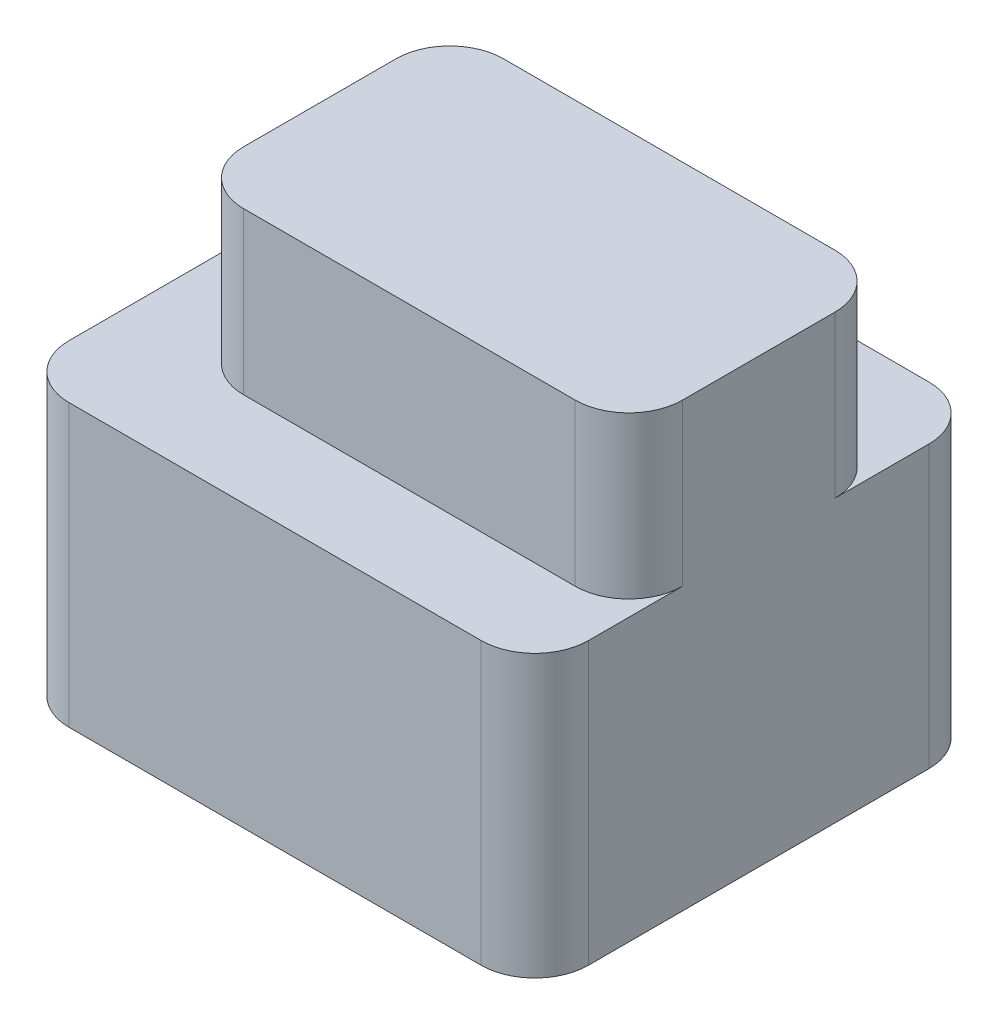
ISO-10303-21;
HEADER;
FILE_DESCRIPTION(('STEP AP214'),'2;1');
FILE_NAME('part.step','',(''),(''),'','','');
FILE_SCHEMA(('AUTOMOTIVE_DESIGN { 1 0 10303 214 1 1 1 1 }'));
ENDSEC;
DATA;
#1=APPLICATION_CONTEXT('core data for automotive mechanical design processes');
#2=APPLICATION_PROTOCOL_DEFINITION('international standard','automotive_design',2000,#1);
#3=PRODUCT_CONTEXT('',#1,'mechanical');
#4=PRODUCT('Part','Part','',(#3));
#5=PRODUCT_RELATED_PRODUCT_CATEGORY('part','',(#4));
#6=PRODUCT_DEFINITION_FORMATION('','',#4);
#7=PRODUCT_DEFINITION_CONTEXT('part definition',#1,'design');
#8=PRODUCT_DEFINITION('design','',#6,#7);
#9=PRODUCT_DEFINITION_SHAPE('','',#8);
#10=(LENGTH_UNIT() NAMED_UNIT(*) SI_UNIT(.MILLI.,.METRE.));
#11=(NAMED_UNIT(*) PLANE_ANGLE_UNIT() SI_UNIT($,.RADIAN.));
#12=(NAMED_UNIT(*) SI_UNIT($,.STERADIAN.) SOLID_ANGLE_UNIT());
#13=UNCERTAINTY_MEASURE_WITH_UNIT(LENGTH_MEASURE(1.E-05),#10,'distance_accuracy_value','');
#14=(GEOMETRIC_REPRESENTATION_CONTEXT(3) GLOBAL_UNCERTAINTY_ASSIGNED_CONTEXT((#13)) GLOBAL_UNIT_ASSIGNED_CONTEXT((#10,
#11,#12)) REPRESENTATION_CONTEXT('',''));
#15=CARTESIAN_POINT('',(0.,0.,0.));
#16=DIRECTION('',(0.,0.,1.));
#17=DIRECTION('',(1.,0.,0.));
#18=AXIS2_PLACEMENT_3D('',#15,#16,#17);
#19=CARTESIAN_POINT('',(0.,0.8,0.));
#20=DIRECTION('',(0.,-1.,0.));
#21=DIRECTION('',(0.,0.,-1.));
#22=AXIS2_PLACEMENT_3D('',#19,#20,#21);
#23=PLANE('',#22);
#24=DIRECTION('',(0.,0.,1.));
#25=VECTOR('',#24,1.);
#26=CARTESIAN_POINT('',(5.8,0.8,110.));
#27=LINE('',#26,#25);
#28=CARTESIAN_POINT('',(5.8,0.8,110.6));
#29=VERTEX_POINT('',#28);
#30=CARTESIAN_POINT('',(5.8,0.8,111.65));
#31=VERTEX_POINT('',#30);
#32=EDGE_CURVE('E222',#29,#31,#27,.T.);
#33=ORIENTED_EDGE('',*,*,#32,.F.);
#34=CARTESIAN_POINT('',(5.2,0.8,110.6));
#35=DIRECTION('',(0.,-1.,0.));
#36=DIRECTION('',(0.,0.,-1.));
#37=AXIS2_PLACEMENT_3D('',#34,#35,#36);
#38=CIRCLE('',#37,0.6);
#39=CARTESIAN_POINT('',(5.2,0.8,110.));
#40=VERTEX_POINT('',#39);
#41=EDGE_CURVE('E238',#29,#40,#38,.F.);
#42=ORIENTED_EDGE('',*,*,#41,.T.);
#43=DIRECTION('',(1.,0.,0.));
#44=VECTOR('',#43,1.);
#45=CARTESIAN_POINT('',(0.,0.8,110.));
#46=LINE('',#45,#44);
#47=CARTESIAN_POINT('',(0.6,0.8,110.));
#48=VERTEX_POINT('',#47);
#49=EDGE_CURVE('E217',#48,#40,#46,.T.);
#50=ORIENTED_EDGE('',*,*,#49,.F.);
#51=CARTESIAN_POINT('',(0.6,0.8,110.6));
#52=DIRECTION('',(0.,-1.,0.));
#53=DIRECTION('',(0.,0.,-1.));
#54=AXIS2_PLACEMENT_3D('',#51,#52,#53);
#55=CIRCLE('',#54,0.6);
#56=CARTESIAN_POINT('',(0.,0.8,110.6));
#57=VERTEX_POINT('',#56);
#58=EDGE_CURVE('E161',#48,#57,#55,.F.);
#59=ORIENTED_EDGE('',*,*,#58,.T.);
#60=DIRECTION('',(0.,0.,-1.));
#61=VECTOR('',#60,1.);
#62=CARTESIAN_POINT('',(0.,0.8,115.));
#63=LINE('',#62,#61);
#64=CARTESIAN_POINT('',(0.,0.8,114.4));
#65=VERTEX_POINT('',#64);
#66=EDGE_CURVE('E207',#65,#57,#63,.T.);
#67=ORIENTED_EDGE('',*,*,#66,.F.);
#68=CARTESIAN_POINT('',(0.6,0.8,114.4));
#69=DIRECTION('',(0.,-1.,0.));
#70=DIRECTION('',(0.,0.,-1.));
#71=AXIS2_PLACEMENT_3D('',#68,#69,#70);
#72=CIRCLE('',#71,0.6);
#73=CARTESIAN_POINT('',(0.6,0.8,115.));
#74=VERTEX_POINT('',#73);
#75=EDGE_CURVE('E236',#65,#74,#72,.F.);
#76=ORIENTED_EDGE('',*,*,#75,.T.);
#77=DIRECTION('',(-1.,0.,0.));
#78=VECTOR('',#77,1.);
#79=CARTESIAN_POINT('',(5.8,0.8,115.));
#80=LINE('',#79,#78);
#81=CARTESIAN_POINT('',(5.2,0.8,115.));
#82=VERTEX_POINT('',#81);
#83=EDGE_CURVE('E167',#82,#74,#80,.T.);
#84=ORIENTED_EDGE('',*,*,#83,.F.);
#85=CARTESIAN_POINT('',(5.2,0.8,114.4));
#86=DIRECTION('',(0.,-1.,0.));
#87=DIRECTION('',(0.,0.,-1.));
#88=AXIS2_PLACEMENT_3D('',#85,#86,#87);
#89=CIRCLE('',#88,0.6);
#90=CARTESIAN_POINT('',(5.8,0.8,114.4));
#91=VERTEX_POINT('',#90);
#92=EDGE_CURVE('E237',#82,#91,#89,.F.);
#93=ORIENTED_EDGE('',*,*,#92,.T.);
#94=CARTESIAN_POINT('',(5.8,0.8,113.35));
#95=VERTEX_POINT('',#94);
#96=EDGE_CURVE('E219',#95,#91,#27,.T.);
#97=ORIENTED_EDGE('',*,*,#96,.F.);
#98=CARTESIAN_POINT('',(5.2,0.8,113.35));
#99=DIRECTION('',(0.,-1.,0.));
#100=DIRECTION('',(0.,0.,-1.));
#101=AXIS2_PLACEMENT_3D('',#98,#99,#100);
#102=CIRCLE('',#101,0.6);
#103=CARTESIAN_POINT('',(5.2,0.8,113.95));
#104=VERTEX_POINT('',#103);
#105=EDGE_CURVE('E11',#95,#104,#102,.T.);
#106=ORIENTED_EDGE('',*,*,#105,.T.);
#107=DIRECTION('',(1.,0.,0.));
#108=VECTOR('',#107,1.);
#109=CARTESIAN_POINT('',(5.8,0.8,113.95));
#110=LINE('',#109,#108);
#111=CARTESIAN_POINT('',(1.5,0.8,113.95));
#112=VERTEX_POINT('',#111);
#113=EDGE_CURVE('E205',#112,#104,#110,.T.);
#114=ORIENTED_EDGE('',*,*,#113,.F.);
#115=CARTESIAN_POINT('',(1.5,0.8,113.35));
#116=DIRECTION('',(0.,-1.,0.));
#117=DIRECTION('',(0.,0.,-1.));
#118=AXIS2_PLACEMENT_3D('',#115,#116,#117);
#119=CIRCLE('',#118,0.6);
#120=CARTESIAN_POINT('',(0.9,0.8,113.35));
#121=VERTEX_POINT('',#120);
#122=EDGE_CURVE('E272',#112,#121,#119,.T.);
#123=ORIENTED_EDGE('',*,*,#122,.T.);
#124=DIRECTION('',(0.,0.,1.));
#125=VECTOR('',#124,1.);
#126=CARTESIAN_POINT('',(0.9,0.8,113.95));
#127=LINE('',#126,#125);
#128=CARTESIAN_POINT('',(0.9,0.8,111.65));
#129=VERTEX_POINT('',#128);
#130=EDGE_CURVE('E215',#129,#121,#127,.T.);
#131=ORIENTED_EDGE('',*,*,#130,.F.);
#132=CARTESIAN_POINT('',(1.5,0.8,111.65));
#133=DIRECTION('',(0.,-1.,0.));
#134=DIRECTION('',(0.,0.,-1.));
#135=AXIS2_PLACEMENT_3D('',#132,#133,#134);
#136=CIRCLE('',#135,0.6);
#137=CARTESIAN_POINT('',(1.5,0.8,111.05));
#138=VERTEX_POINT('',#137);
#139=EDGE_CURVE('E271',#129,#138,#136,.T.);
#140=ORIENTED_EDGE('',*,*,#139,.T.);
#141=DIRECTION('',(-1.,0.,0.));
#142=VECTOR('',#141,1.);
#143=CARTESIAN_POINT('',(0.9,0.8,111.05));
#144=LINE('',#143,#142);
#145=CARTESIAN_POINT('',(5.2,0.8,111.05));
#146=VERTEX_POINT('',#145);
#147=EDGE_CURVE('E197',#146,#138,#144,.T.);
#148=ORIENTED_EDGE('',*,*,#147,.F.);
#149=CARTESIAN_POINT('',(5.2,0.8,111.65));
#150=DIRECTION('',(0.,-1.,0.));
#151=DIRECTION('',(0.,0.,-1.));
#152=AXIS2_PLACEMENT_3D('',#149,#150,#151);
#153=CIRCLE('',#152,0.6);
#154=EDGE_CURVE('E47',#146,#31,#153,.T.);
#155=ORIENTED_EDGE('',*,*,#154,.T.);
#156=EDGE_LOOP('',(#33,#42,#50,#59,#67,#76,#84,#93,#97,#106,#114,#123,#131,#140,#148,#155));
#157=FACE_BOUND('',#156,.T.);
#158=ADVANCED_FACE('F41',(#157),#23,.F.);
#159=CARTESIAN_POINT('',(0.,0.8,115.));
#160=DIRECTION('',(-1.,0.,0.));
#161=DIRECTION('',(0.,0.,1.));
#162=AXIS2_PLACEMENT_3D('',#159,#160,#161);
#163=PLANE('',#162);
#164=DIRECTION('',(0.,-1.,0.));
#165=VECTOR('',#164,1.);
#166=CARTESIAN_POINT('',(0.,0.8,110.6));
#167=LINE('',#166,#165);
#168=CARTESIAN_POINT('',(0.,-2.34,110.6));
#169=VERTEX_POINT('',#168);
#170=EDGE_CURVE('E249',#57,#169,#167,.T.);
#171=ORIENTED_EDGE('',*,*,#170,.T.);
#172=DIRECTION('',(0.,0.,-1.));
#173=VECTOR('',#172,1.);
#174=CARTESIAN_POINT('',(0.,-2.34,114.4));
#175=LINE('',#174,#173);
#176=CARTESIAN_POINT('',(0.,-2.34,114.4));
#177=VERTEX_POINT('',#176);
#178=EDGE_CURVE('E182',#177,#169,#175,.T.);
#179=ORIENTED_EDGE('',*,*,#178,.F.);
#180=DIRECTION('',(0.,-1.,0.));
#181=VECTOR('',#180,1.);
#182=CARTESIAN_POINT('',(0.,0.8,114.4));
#183=LINE('',#182,#181);
#184=EDGE_CURVE('E250',#177,#65,#183,.F.);
#185=ORIENTED_EDGE('',*,*,#184,.T.);
#186=ORIENTED_EDGE('',*,*,#66,.T.);
#187=EDGE_LOOP('',(#171,#179,#185,#186));
#188=FACE_BOUND('',#187,.T.);
#189=ADVANCED_FACE('F309',(#188),#163,.T.);
#190=CARTESIAN_POINT('',(5.8,0.8,115.));
#191=DIRECTION('',(0.,0.,1.));
#192=DIRECTION('',(1.,0.,0.));
#193=AXIS2_PLACEMENT_3D('',#190,#191,#192);
#194=PLANE('',#193);
#195=ORIENTED_EDGE('',*,*,#83,.T.);
#196=DIRECTION('',(0.,-1.,0.));
#197=VECTOR('',#196,1.);
#198=CARTESIAN_POINT('',(0.6,0.8,115.));
#199=LINE('',#198,#197);
#200=CARTESIAN_POINT('',(0.6,-2.34,115.));
#201=VERTEX_POINT('',#200);
#202=EDGE_CURVE('E243',#74,#201,#199,.T.);
#203=ORIENTED_EDGE('',*,*,#202,.T.);
#204=DIRECTION('',(-1.,0.,0.));
#205=VECTOR('',#204,1.);
#206=CARTESIAN_POINT('',(5.2,-2.34,115.));
#207=LINE('',#206,#205);
#208=CARTESIAN_POINT('',(5.2,-2.34,115.));
#209=VERTEX_POINT('',#208);
#210=EDGE_CURVE('E194',#209,#201,#207,.T.);
#211=ORIENTED_EDGE('',*,*,#210,.F.);
#212=DIRECTION('',(0.,-1.,0.));
#213=VECTOR('',#212,1.);
#214=CARTESIAN_POINT('',(5.2,0.8,115.));
#215=LINE('',#214,#213);
#216=EDGE_CURVE('E245',#209,#82,#215,.F.);
#217=ORIENTED_EDGE('',*,*,#216,.T.);
#218=EDGE_LOOP('',(#195,#203,#211,#217));
#219=FACE_BOUND('',#218,.T.);
#220=ADVANCED_FACE('F305',(#219),#194,.T.);
#221=CARTESIAN_POINT('',(5.8,0.8,110.));
#222=DIRECTION('',(1.,0.,0.));
#223=DIRECTION('',(0.,0.,-1.));
#224=AXIS2_PLACEMENT_3D('',#221,#222,#223);
#225=PLANE('',#224);
#226=DIRECTION('',(0.,-1.,0.));
#227=VECTOR('',#226,1.);
#228=CARTESIAN_POINT('',(5.8,0.8,114.4));
#229=LINE('',#228,#227);
#230=CARTESIAN_POINT('',(5.8,-2.34,114.4));
#231=VERTEX_POINT('',#230);
#232=EDGE_CURVE('E234',#91,#231,#229,.T.);
#233=ORIENTED_EDGE('',*,*,#232,.T.);
#234=DIRECTION('',(0.,0.,1.));
#235=VECTOR('',#234,1.);
#236=CARTESIAN_POINT('',(5.8,-2.34,110.6));
#237=LINE('',#236,#235);
#238=CARTESIAN_POINT('',(5.8,-2.34,110.6));
#239=VERTEX_POINT('',#238);
#240=EDGE_CURVE('E183',#239,#231,#237,.T.);
#241=ORIENTED_EDGE('',*,*,#240,.F.);
#242=DIRECTION('',(0.,-1.,0.));
#243=VECTOR('',#242,1.);
#244=CARTESIAN_POINT('',(5.8,0.8,110.6));
#245=LINE('',#244,#243);
#246=EDGE_CURVE('E235',#239,#29,#245,.F.);
#247=ORIENTED_EDGE('',*,*,#246,.T.);
#248=ORIENTED_EDGE('',*,*,#32,.T.);
#249=DIRECTION('',(0.,-1.,0.));
#250=VECTOR('',#249,1.);
#251=CARTESIAN_POINT('',(5.8,2.6,111.65));
#252=LINE('',#251,#250);
#253=CARTESIAN_POINT('',(5.8,2.6,111.65));
#254=VERTEX_POINT('',#253);
#255=EDGE_CURVE('E228',#31,#254,#252,.F.);
#256=ORIENTED_EDGE('',*,*,#255,.T.);
#257=DIRECTION('',(0.,0.,-1.));
#258=VECTOR('',#257,1.);
#259=CARTESIAN_POINT('',(5.8,2.6,111.05));
#260=LINE('',#259,#258);
#261=CARTESIAN_POINT('',(5.8,2.6,113.35));
#262=VERTEX_POINT('',#261);
#263=EDGE_CURVE('E196',#262,#254,#260,.T.);
#264=ORIENTED_EDGE('',*,*,#263,.F.);
#265=DIRECTION('',(0.,-1.,0.));
#266=VECTOR('',#265,1.);
#267=CARTESIAN_POINT('',(5.8,0.8,113.35));
#268=LINE('',#267,#266);
#269=EDGE_CURVE('E226',#262,#95,#268,.T.);
#270=ORIENTED_EDGE('',*,*,#269,.T.);
#271=ORIENTED_EDGE('',*,*,#96,.T.);
#272=EDGE_LOOP('',(#233,#241,#247,#248,#256,#264,#270,#271));
#273=FACE_BOUND('',#272,.T.);
#274=ADVANCED_FACE('F289',(#273),#225,.T.);
#275=CARTESIAN_POINT('',(0.,0.8,110.));
#276=DIRECTION('',(0.,0.,-1.));
#277=DIRECTION('',(-1.,0.,0.));
#278=AXIS2_PLACEMENT_3D('',#275,#276,#277);
#279=PLANE('',#278);
#280=ORIENTED_EDGE('',*,*,#49,.T.);
#281=DIRECTION('',(0.,-1.,0.));
#282=VECTOR('',#281,1.);
#283=CARTESIAN_POINT('',(5.2,0.8,110.));
#284=LINE('',#283,#282);
#285=CARTESIAN_POINT('',(5.2,-2.34,110.));
#286=VERTEX_POINT('',#285);
#287=EDGE_CURVE('E164',#40,#286,#284,.T.);
#288=ORIENTED_EDGE('',*,*,#287,.T.);
#289=DIRECTION('',(1.,0.,0.));
#290=VECTOR('',#289,1.);
#291=CARTESIAN_POINT('',(0.6,-2.34,110.));
#292=LINE('',#291,#290);
#293=CARTESIAN_POINT('',(0.6,-2.34,110.));
#294=VERTEX_POINT('',#293);
#295=EDGE_CURVE('E166',#294,#286,#292,.T.);
#296=ORIENTED_EDGE('',*,*,#295,.F.);
#297=DIRECTION('',(0.,-1.,0.));
#298=VECTOR('',#297,1.);
#299=CARTESIAN_POINT('',(0.6,0.8,110.));
#300=LINE('',#299,#298);
#301=EDGE_CURVE('E154',#294,#48,#300,.F.);
#302=ORIENTED_EDGE('',*,*,#301,.T.);
#303=EDGE_LOOP('',(#280,#288,#296,#302));
#304=FACE_BOUND('',#303,.T.);
#305=ADVANCED_FACE('F168',(#304),#279,.T.);
#306=CARTESIAN_POINT('',(0.9,2.6,111.05));
#307=DIRECTION('',(0.,0.,1.));
#308=DIRECTION('',(1.,0.,0.));
#309=AXIS2_PLACEMENT_3D('',#306,#307,#308);
#310=PLANE('',#309);
#311=ORIENTED_EDGE('',*,*,#147,.T.);
#312=DIRECTION('',(0.,-1.,0.));
#313=VECTOR('',#312,1.);
#314=CARTESIAN_POINT('',(1.5,2.6,111.05));
#315=LINE('',#314,#313);
#316=CARTESIAN_POINT('',(1.5,2.6,111.05));
#317=VERTEX_POINT('',#316);
#318=EDGE_CURVE('E256',#138,#317,#315,.F.);
#319=ORIENTED_EDGE('',*,*,#318,.T.);
#320=DIRECTION('',(-1.,0.,0.));
#321=VECTOR('',#320,1.);
#322=CARTESIAN_POINT('',(0.9,2.6,111.05));
#323=LINE('',#322,#321);
#324=CARTESIAN_POINT('',(5.2,2.6,111.05));
#325=VERTEX_POINT('',#324);
#326=EDGE_CURVE('E203',#325,#317,#323,.T.);
#327=ORIENTED_EDGE('',*,*,#326,.F.);
#328=DIRECTION('',(0.,-1.,0.));
#329=VECTOR('',#328,1.);
#330=CARTESIAN_POINT('',(5.2,0.8,111.05));
#331=LINE('',#330,#329);
#332=EDGE_CURVE('E254',#325,#146,#331,.T.);
#333=ORIENTED_EDGE('',*,*,#332,.T.);
#334=EDGE_LOOP('',(#311,#319,#327,#333));
#335=FACE_BOUND('',#334,.T.);
#336=ADVANCED_FACE('F334',(#335),#310,.F.);
#337=CARTESIAN_POINT('',(0.9,2.6,113.95));
#338=DIRECTION('',(1.,0.,0.));
#339=DIRECTION('',(0.,0.,-1.));
#340=AXIS2_PLACEMENT_3D('',#337,#338,#339);
#341=PLANE('',#340);
#342=DIRECTION('',(0.,0.,1.));
#343=VECTOR('',#342,1.);
#344=CARTESIAN_POINT('',(0.9,2.6,113.95));
#345=LINE('',#344,#343);
#346=CARTESIAN_POINT('',(0.9,2.6,111.65));
#347=VERTEX_POINT('',#346);
#348=CARTESIAN_POINT('',(0.9,2.6,113.35));
#349=VERTEX_POINT('',#348);
#350=EDGE_CURVE('E202',#347,#349,#345,.T.);
#351=ORIENTED_EDGE('',*,*,#350,.F.);
#352=DIRECTION('',(0.,-1.,0.));
#353=VECTOR('',#352,1.);
#354=CARTESIAN_POINT('',(0.9,2.6,111.65));
#355=LINE('',#354,#353);
#356=EDGE_CURVE('E252',#347,#129,#355,.T.);
#357=ORIENTED_EDGE('',*,*,#356,.T.);
#358=ORIENTED_EDGE('',*,*,#130,.T.);
#359=DIRECTION('',(0.,-1.,0.));
#360=VECTOR('',#359,1.);
#361=CARTESIAN_POINT('',(0.9,2.6,113.35));
#362=LINE('',#361,#360);
#363=EDGE_CURVE('E247',#121,#349,#362,.F.);
#364=ORIENTED_EDGE('',*,*,#363,.T.);
#365=EDGE_LOOP('',(#351,#357,#358,#364));
#366=FACE_BOUND('',#365,.T.);
#367=ADVANCED_FACE('F344',(#366),#341,.F.);
#368=CARTESIAN_POINT('',(5.8,2.6,113.95));
#369=DIRECTION('',(0.,0.,-1.));
#370=DIRECTION('',(-1.,0.,0.));
#371=AXIS2_PLACEMENT_3D('',#368,#369,#370);
#372=PLANE('',#371);
#373=DIRECTION('',(1.,0.,0.));
#374=VECTOR('',#373,1.);
#375=CARTESIAN_POINT('',(5.8,2.6,113.95));
#376=LINE('',#375,#374);
#377=CARTESIAN_POINT('',(1.5,2.6,113.95));
#378=VERTEX_POINT('',#377);
#379=CARTESIAN_POINT('',(5.2,2.6,113.95));
#380=VERTEX_POINT('',#379);
#381=EDGE_CURVE('E210',#378,#380,#376,.T.);
#382=ORIENTED_EDGE('',*,*,#381,.F.);
#383=DIRECTION('',(0.,-1.,0.));
#384=VECTOR('',#383,1.);
#385=CARTESIAN_POINT('',(1.5,2.6,113.95));
#386=LINE('',#385,#384);
#387=EDGE_CURVE('E268',#378,#112,#386,.T.);
#388=ORIENTED_EDGE('',*,*,#387,.T.);
#389=ORIENTED_EDGE('',*,*,#113,.T.);
#390=DIRECTION('',(0.,-1.,0.));
#391=VECTOR('',#390,1.);
#392=CARTESIAN_POINT('',(5.2,2.6,113.95));
#393=LINE('',#392,#391);
#394=EDGE_CURVE('E57',#104,#380,#393,.F.);
#395=ORIENTED_EDGE('',*,*,#394,.T.);
#396=EDGE_LOOP('',(#382,#388,#389,#395));
#397=FACE_BOUND('',#396,.T.);
#398=ADVANCED_FACE('F325',(#397),#372,.F.);
#399=CARTESIAN_POINT('',(0.,2.6,0.));
#400=DIRECTION('',(0.,-1.,0.));
#401=DIRECTION('',(0.,0.,-1.));
#402=AXIS2_PLACEMENT_3D('',#399,#400,#401);
#403=PLANE('',#402);
#404=ORIENTED_EDGE('',*,*,#326,.T.);
#405=CARTESIAN_POINT('',(1.5,2.6,111.65));
#406=DIRECTION('',(0.,-1.,0.));
#407=DIRECTION('',(0.,0.,-1.));
#408=AXIS2_PLACEMENT_3D('',#405,#406,#407);
#409=CIRCLE('',#408,0.6);
#410=EDGE_CURVE('E264',#317,#347,#409,.F.);
#411=ORIENTED_EDGE('',*,*,#410,.T.);
#412=ORIENTED_EDGE('',*,*,#350,.T.);
#413=CARTESIAN_POINT('',(1.5,2.6,113.35));
#414=DIRECTION('',(0.,-1.,0.));
#415=DIRECTION('',(0.,0.,-1.));
#416=AXIS2_PLACEMENT_3D('',#413,#414,#415);
#417=CIRCLE('',#416,0.6);
#418=EDGE_CURVE('E62',#349,#378,#417,.F.);
#419=ORIENTED_EDGE('',*,*,#418,.T.);
#420=ORIENTED_EDGE('',*,*,#381,.T.);
#421=CARTESIAN_POINT('',(5.2,2.6,113.35));
#422=DIRECTION('',(0.,-1.,0.));
#423=DIRECTION('',(0.,0.,-1.));
#424=AXIS2_PLACEMENT_3D('',#421,#422,#423);
#425=CIRCLE('',#424,0.6);
#426=EDGE_CURVE('E257',#380,#262,#425,.F.);
#427=ORIENTED_EDGE('',*,*,#426,.T.);
#428=ORIENTED_EDGE('',*,*,#263,.T.);
#429=CARTESIAN_POINT('',(5.2,2.6,111.65));
#430=DIRECTION('',(0.,-1.,0.));
#431=DIRECTION('',(0.,0.,-1.));
#432=AXIS2_PLACEMENT_3D('',#429,#430,#431);
#433=CIRCLE('',#432,0.6);
#434=EDGE_CURVE('E265',#254,#325,#433,.F.);
#435=ORIENTED_EDGE('',*,*,#434,.T.);
#436=EDGE_LOOP('',(#404,#411,#412,#419,#420,#427,#428,#435));
#437=FACE_BOUND('',#436,.T.);
#438=ADVANCED_FACE('F290',(#437),#403,.F.);
#439=CARTESIAN_POINT('',(5.2,0.8,110.6));
#440=DIRECTION('',(0.,-1.,0.));
#441=DIRECTION('',(0.,0.,-1.));
#442=AXIS2_PLACEMENT_3D('',#439,#440,#441);
#443=CYLINDRICAL_SURFACE('',#442,0.6);
#444=ORIENTED_EDGE('',*,*,#41,.F.);
#445=ORIENTED_EDGE('',*,*,#246,.F.);
#446=CARTESIAN_POINT('',(5.2,-2.34,110.6));
#447=DIRECTION('',(0.,-1.,0.));
#448=DIRECTION('',(0.,0.,-1.));
#449=AXIS2_PLACEMENT_3D('',#446,#447,#448);
#450=CIRCLE('',#449,0.600000000000002);
#451=EDGE_CURVE('E174',#286,#239,#450,.T.);
#452=ORIENTED_EDGE('',*,*,#451,.F.);
#453=ORIENTED_EDGE('',*,*,#287,.F.);
#454=EDGE_LOOP('',(#444,#445,#452,#453));
#455=FACE_BOUND('',#454,.T.);
#456=ADVANCED_FACE('F311',(#455),#443,.T.);
#457=CARTESIAN_POINT('',(0.6,0.8,114.4));
#458=DIRECTION('',(0.,-1.,0.));
#459=DIRECTION('',(0.,0.,-1.));
#460=AXIS2_PLACEMENT_3D('',#457,#458,#459);
#461=CYLINDRICAL_SURFACE('',#460,0.6);
#462=ORIENTED_EDGE('',*,*,#75,.F.);
#463=ORIENTED_EDGE('',*,*,#184,.F.);
#464=CARTESIAN_POINT('',(0.6,-2.34,114.4));
#465=DIRECTION('',(0.,-1.,0.));
#466=DIRECTION('',(0.,0.,-1.));
#467=AXIS2_PLACEMENT_3D('',#464,#465,#466);
#468=CIRCLE('',#467,0.600000000000002);
#469=EDGE_CURVE('E193',#201,#177,#468,.T.);
#470=ORIENTED_EDGE('',*,*,#469,.F.);
#471=ORIENTED_EDGE('',*,*,#202,.F.);
#472=EDGE_LOOP('',(#462,#463,#470,#471));
#473=FACE_BOUND('',#472,.T.);
#474=ADVANCED_FACE('F306',(#473),#461,.T.);
#475=CARTESIAN_POINT('',(5.2,0.8,114.4));
#476=DIRECTION('',(0.,-1.,0.));
#477=DIRECTION('',(0.,0.,-1.));
#478=AXIS2_PLACEMENT_3D('',#475,#476,#477);
#479=CYLINDRICAL_SURFACE('',#478,0.6);
#480=ORIENTED_EDGE('',*,*,#92,.F.);
#481=ORIENTED_EDGE('',*,*,#216,.F.);
#482=CARTESIAN_POINT('',(5.2,-2.34,114.4));
#483=DIRECTION('',(0.,-1.,0.));
#484=DIRECTION('',(0.,0.,-1.));
#485=AXIS2_PLACEMENT_3D('',#482,#483,#484);
#486=CIRCLE('',#485,0.600000000000002);
#487=EDGE_CURVE('E187',#231,#209,#486,.T.);
#488=ORIENTED_EDGE('',*,*,#487,.F.);
#489=ORIENTED_EDGE('',*,*,#232,.F.);
#490=EDGE_LOOP('',(#480,#481,#488,#489));
#491=FACE_BOUND('',#490,.T.);
#492=ADVANCED_FACE('F298',(#491),#479,.T.);
#493=CARTESIAN_POINT('',(1.5,2.6,111.65));
#494=DIRECTION('',(0.,-1.,0.));
#495=DIRECTION('',(0.,0.,-1.));
#496=AXIS2_PLACEMENT_3D('',#493,#494,#495);
#497=CYLINDRICAL_SURFACE('',#496,0.6);
#498=ORIENTED_EDGE('',*,*,#410,.F.);
#499=ORIENTED_EDGE('',*,*,#318,.F.);
#500=ORIENTED_EDGE('',*,*,#139,.F.);
#501=ORIENTED_EDGE('',*,*,#356,.F.);
#502=EDGE_LOOP('',(#498,#499,#500,#501));
#503=FACE_BOUND('',#502,.T.);
#504=ADVANCED_FACE('F348',(#503),#497,.T.);
#505=CARTESIAN_POINT('',(0.6,0.8,110.6));
#506=DIRECTION('',(0.,-1.,0.));
#507=DIRECTION('',(0.,0.,-1.));
#508=AXIS2_PLACEMENT_3D('',#505,#506,#507);
#509=CYLINDRICAL_SURFACE('',#508,0.6);
#510=ORIENTED_EDGE('',*,*,#58,.F.);
#511=ORIENTED_EDGE('',*,*,#301,.F.);
#512=CARTESIAN_POINT('',(0.6,-2.34,110.6));
#513=DIRECTION('',(0.,-1.,0.));
#514=DIRECTION('',(0.,0.,-1.));
#515=AXIS2_PLACEMENT_3D('',#512,#513,#514);
#516=CIRCLE('',#515,0.600000000000002);
#517=EDGE_CURVE('E159',#169,#294,#516,.T.);
#518=ORIENTED_EDGE('',*,*,#517,.F.);
#519=ORIENTED_EDGE('',*,*,#170,.F.);
#520=EDGE_LOOP('',(#510,#511,#518,#519));
#521=FACE_BOUND('',#520,.T.);
#522=ADVANCED_FACE('F160',(#521),#509,.T.);
#523=CARTESIAN_POINT('',(1.5,2.6,113.35));
#524=DIRECTION('',(0.,-1.,0.));
#525=DIRECTION('',(0.,0.,-1.));
#526=AXIS2_PLACEMENT_3D('',#523,#524,#525);
#527=CYLINDRICAL_SURFACE('',#526,0.6);
#528=ORIENTED_EDGE('',*,*,#418,.F.);
#529=ORIENTED_EDGE('',*,*,#363,.F.);
#530=ORIENTED_EDGE('',*,*,#122,.F.);
#531=ORIENTED_EDGE('',*,*,#387,.F.);
#532=EDGE_LOOP('',(#528,#529,#530,#531));
#533=FACE_BOUND('',#532,.T.);
#534=ADVANCED_FACE('F359',(#533),#527,.T.);
#535=CARTESIAN_POINT('',(5.2,2.6,111.65));
#536=DIRECTION('',(0.,1.,0.));
#537=DIRECTION('',(0.,0.,1.));
#538=AXIS2_PLACEMENT_3D('',#535,#536,#537);
#539=CYLINDRICAL_SURFACE('',#538,0.6);
#540=ORIENTED_EDGE('',*,*,#434,.F.);
#541=ORIENTED_EDGE('',*,*,#255,.F.);
#542=ORIENTED_EDGE('',*,*,#154,.F.);
#543=ORIENTED_EDGE('',*,*,#332,.F.);
#544=EDGE_LOOP('',(#540,#541,#542,#543));
#545=FACE_BOUND('',#544,.T.);
#546=ADVANCED_FACE('F282',(#545),#539,.T.);
#547=CARTESIAN_POINT('',(5.2,0.8,113.35));
#548=DIRECTION('',(0.,1.,0.));
#549=DIRECTION('',(0.,0.,1.));
#550=AXIS2_PLACEMENT_3D('',#547,#548,#549);
#551=CYLINDRICAL_SURFACE('',#550,0.6);
#552=ORIENTED_EDGE('',*,*,#426,.F.);
#553=ORIENTED_EDGE('',*,*,#394,.F.);
#554=ORIENTED_EDGE('',*,*,#105,.F.);
#555=ORIENTED_EDGE('',*,*,#269,.F.);
#556=EDGE_LOOP('',(#552,#553,#554,#555));
#557=FACE_BOUND('',#556,.T.);
#558=ADVANCED_FACE('F43',(#557),#551,.T.);
#559=CARTESIAN_POINT('',(0.6,-2.34,110.6));
#560=DIRECTION('',(0.,-1.,0.));
#561=DIRECTION('',(0.,0.,-1.));
#562=AXIS2_PLACEMENT_3D('',#559,#560,#561);
#563=PLANE('',#562);
#564=ORIENTED_EDGE('',*,*,#517,.T.);
#565=ORIENTED_EDGE('',*,*,#295,.T.);
#566=ORIENTED_EDGE('',*,*,#451,.T.);
#567=ORIENTED_EDGE('',*,*,#240,.T.);
#568=ORIENTED_EDGE('',*,*,#487,.T.);
#569=ORIENTED_EDGE('',*,*,#210,.T.);
#570=ORIENTED_EDGE('',*,*,#469,.T.);
#571=ORIENTED_EDGE('',*,*,#178,.T.);
#572=EDGE_LOOP('',(#564,#565,#566,#567,#568,#569,#570,#571));
#573=FACE_BOUND('',#572,.T.);
#574=ADVANCED_FACE('F180',(#573),#563,.T.);
#575=CLOSED_SHELL('',(#158,#189,#220,#274,#305,#336,#367,#398,#438,#456,#474,#492,#504,#522,
#534,#546,#558,#574));
#576=MANIFOLD_SOLID_BREP('B2',#575);
#577=ADVANCED_BREP_SHAPE_REPRESENTATION('',(#18,#576),#14);
#578=SHAPE_DEFINITION_REPRESENTATION(#9,#577);
ENDSEC;
END-ISO-10303-21;
